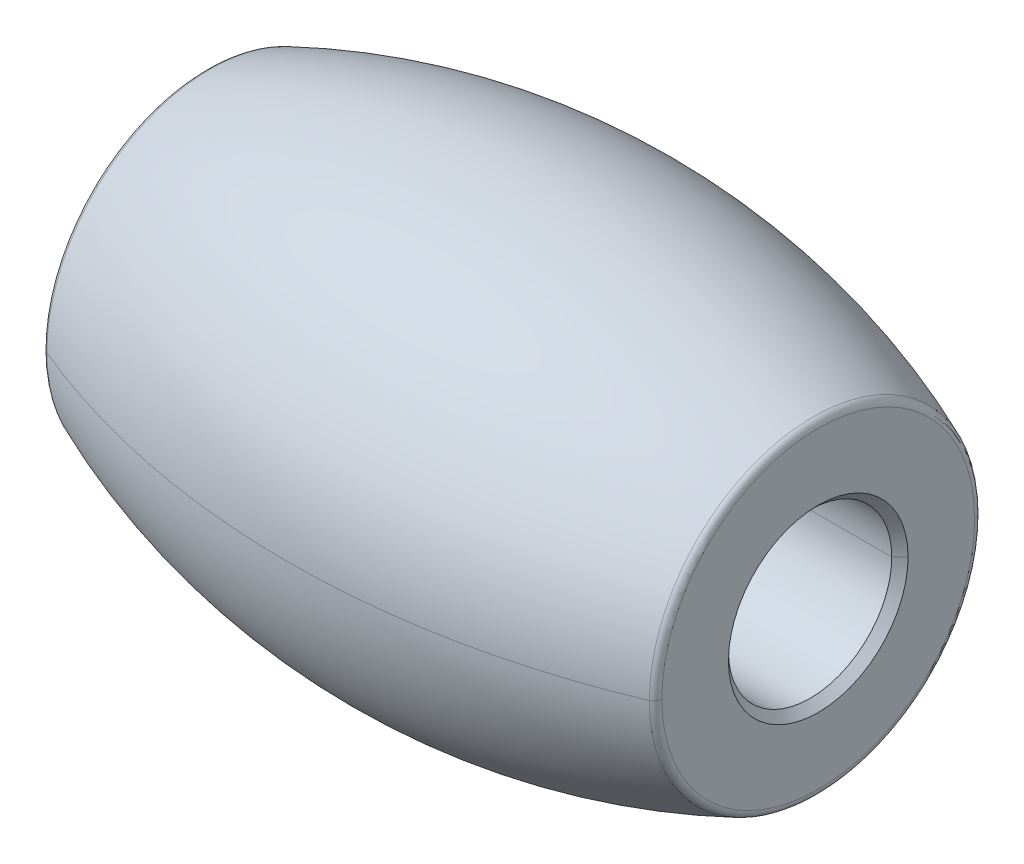
ISO-10303-21;
HEADER;
FILE_DESCRIPTION(('STEP AP214'),'2;1');
FILE_NAME('part.step','',(''),(''),'','','');
FILE_SCHEMA(('AUTOMOTIVE_DESIGN { 1 0 10303 214 1 1 1 1 }'));
ENDSEC;
DATA;
#1=APPLICATION_CONTEXT('core data for automotive mechanical design processes');
#2=APPLICATION_PROTOCOL_DEFINITION('international standard','automotive_design',2000,#1);
#3=PRODUCT_CONTEXT('',#1,'mechanical');
#4=PRODUCT('Part','Part','',(#3));
#5=PRODUCT_RELATED_PRODUCT_CATEGORY('part','',(#4));
#6=PRODUCT_DEFINITION_FORMATION('','',#4);
#7=PRODUCT_DEFINITION_CONTEXT('part definition',#1,'design');
#8=PRODUCT_DEFINITION('design','',#6,#7);
#9=PRODUCT_DEFINITION_SHAPE('','',#8);
#10=(LENGTH_UNIT() NAMED_UNIT(*) SI_UNIT(.MILLI.,.METRE.));
#11=(NAMED_UNIT(*) PLANE_ANGLE_UNIT() SI_UNIT($,.RADIAN.));
#12=(NAMED_UNIT(*) SI_UNIT($,.STERADIAN.) SOLID_ANGLE_UNIT());
#13=UNCERTAINTY_MEASURE_WITH_UNIT(LENGTH_MEASURE(1.E-05),#10,'distance_accuracy_value','');
#14=(GEOMETRIC_REPRESENTATION_CONTEXT(3) GLOBAL_UNCERTAINTY_ASSIGNED_CONTEXT((#13)) GLOBAL_UNIT_ASSIGNED_CONTEXT((#10,
#11,#12)) REPRESENTATION_CONTEXT('',''));
#15=CARTESIAN_POINT('',(0.,0.,0.));
#16=DIRECTION('',(0.,0.,1.));
#17=DIRECTION('',(1.,0.,0.));
#18=AXIS2_PLACEMENT_3D('',#15,#16,#17);
#19=CARTESIAN_POINT('',(211163.408086923,8890.65707126317,4.09347902796675E-10));
#20=DIRECTION('',(1.,0.,0.));
#21=DIRECTION('',(0.,0.,-1.));
#22=AXIS2_PLACEMENT_3D('',#19,#20,#21);
#23=CONICAL_SURFACE('',#22,2.19999999999843,0.785398163308631);
#24=CARTESIAN_POINT('',(211163.208086923,8890.65707126317,3.9974794308062E-10));
#25=DIRECTION('',(-1.,0.,0.));
#26=DIRECTION('',(0.,0.,1.));
#27=AXIS2_PLACEMENT_3D('',#24,#25,#26);
#28=CIRCLE('',#27,1.9999999999989);
#29=CARTESIAN_POINT('',(211163.208086923,8890.65707126315,-1.99999999959914));
#30=VERTEX_POINT('',#29);
#31=CARTESIAN_POINT('',(211163.208086923,8890.65707126317,2.00000000039865));
#32=VERTEX_POINT('',#31);
#33=EDGE_CURVE('E11',#30,#32,#28,.T.);
#34=ORIENTED_EDGE('',*,*,#33,.T.);
#35=DIRECTION('',(0.707106781249349,0.,0.707106781123746));
#36=VECTOR('',#35,1.);
#37=CARTESIAN_POINT('',(211163.408086923,8890.65707126317,2.20000000040779));
#38=LINE('',#37,#36);
#39=CARTESIAN_POINT('',(211163.408086923,8890.65707126317,2.20000000040779));
#40=VERTEX_POINT('',#39);
#41=EDGE_CURVE('E27',#32,#40,#38,.T.);
#42=ORIENTED_EDGE('',*,*,#41,.T.);
#43=CARTESIAN_POINT('',(211163.408086923,8890.65707126317,4.09347902796675E-10));
#44=DIRECTION('',(-1.,0.,0.));
#45=DIRECTION('',(0.,0.,1.));
#46=AXIS2_PLACEMENT_3D('',#43,#44,#45);
#47=CIRCLE('',#46,2.19999999999843);
#48=CARTESIAN_POINT('',(211163.408086923,8890.65707126317,-2.19999999958909));
#49=VERTEX_POINT('',#48);
#50=EDGE_CURVE('E124',#49,#40,#47,.T.);
#51=ORIENTED_EDGE('',*,*,#50,.F.);
#52=DIRECTION('',(0.707106781249349,0.,-0.707106781123746));
#53=VECTOR('',#52,1.);
#54=CARTESIAN_POINT('',(211163.408086923,8890.65707126317,-2.19999999958909));
#55=LINE('',#54,#53);
#56=EDGE_CURVE('E120',#30,#49,#55,.T.);
#57=ORIENTED_EDGE('',*,*,#56,.F.);
#58=EDGE_LOOP('',(#34,#42,#51,#57));
#59=FACE_BOUND('',#58,.T.);
#60=ADVANCED_FACE('F16',(#59),#23,.F.);
#61=CARTESIAN_POINT('',(211146.908086923,8890.65707126315,3.73071365467048E-10));
#62=DIRECTION('',(-1.,0.,0.));
#63=DIRECTION('',(0.,0.,1.));
#64=AXIS2_PLACEMENT_3D('',#61,#62,#63);
#65=CYLINDRICAL_SURFACE('',#64,1.9999999999989);
#66=ORIENTED_EDGE('',*,*,#33,.F.);
#67=DIRECTION('',(-1.,0.,0.));
#68=VECTOR('',#67,1.);
#69=CARTESIAN_POINT('',(211146.908086923,8890.65707126315,-1.99999999962583));
#70=LINE('',#69,#68);
#71=CARTESIAN_POINT('',(211157.858086923,8890.65707126315,-1.99999999963489));
#72=VERTEX_POINT('',#71);
#73=EDGE_CURVE('E135',#30,#72,#70,.T.);
#74=ORIENTED_EDGE('',*,*,#73,.T.);
#75=CARTESIAN_POINT('',(211157.858086923,8890.65707126314,3.64000496411165E-10));
#76=DIRECTION('',(-1.,0.,0.));
#77=DIRECTION('',(0.,0.,1.));
#78=AXIS2_PLACEMENT_3D('',#75,#76,#77);
#79=CIRCLE('',#78,1.9999999999989);
#80=CARTESIAN_POINT('',(211157.858086923,8890.65707126314,2.00000000036291));
#81=VERTEX_POINT('',#80);
#82=EDGE_CURVE('E140',#72,#81,#79,.T.);
#83=ORIENTED_EDGE('',*,*,#82,.T.);
#84=DIRECTION('',(-1.,0.,0.));
#85=VECTOR('',#84,1.);
#86=CARTESIAN_POINT('',(211146.908086923,8890.65707126315,2.00000000037197));
#87=LINE('',#86,#85);
#88=EDGE_CURVE('E42',#32,#81,#87,.T.);
#89=ORIENTED_EDGE('',*,*,#88,.F.);
#90=EDGE_LOOP('',(#66,#74,#83,#89));
#91=FACE_BOUND('',#90,.T.);
#92=ADVANCED_FACE('F142',(#91),#65,.F.);
#93=CARTESIAN_POINT('',(211146.908086923,8890.65707126315,3.73071365467048E-10));
#94=DIRECTION('',(-1.,0.,0.));
#95=DIRECTION('',(0.,0.,1.));
#96=AXIS2_PLACEMENT_3D('',#93,#94,#95);
#97=CYLINDRICAL_SURFACE('',#96,1.09999999999744);
#98=CARTESIAN_POINT('',(211157.858086923,8890.65707126315,2.97747937416659E-10));
#99=DIRECTION('',(-1.,0.,0.));
#100=DIRECTION('',(0.,0.,1.));
#101=AXIS2_PLACEMENT_3D('',#98,#99,#100);
#102=CIRCLE('',#101,1.09999999999744);
#103=CARTESIAN_POINT('',(211157.858086923,8890.65707126315,-1.09999999969969));
#104=VERTEX_POINT('',#103);
#105=CARTESIAN_POINT('',(211157.858086923,8890.65707126315,1.10000000029519));
#106=VERTEX_POINT('',#105);
#107=EDGE_CURVE('E184',#104,#106,#102,.T.);
#108=ORIENTED_EDGE('',*,*,#107,.F.);
#109=DIRECTION('',(-1.,0.,0.));
#110=VECTOR('',#109,1.);
#111=CARTESIAN_POINT('',(211146.908086923,8890.65707126315,-1.09999999962437));
#112=LINE('',#111,#110);
#113=CARTESIAN_POINT('',(211153.958086923,8890.65707126315,-1.09999999955074));
#114=VERTEX_POINT('',#113);
#115=EDGE_CURVE('E200',#104,#114,#112,.T.);
#116=ORIENTED_EDGE('',*,*,#115,.T.);
#117=CARTESIAN_POINT('',(211153.958086923,8890.65707126316,4.46691295064028E-10));
#118=DIRECTION('',(-1.,0.,0.));
#119=DIRECTION('',(0.,0.,1.));
#120=AXIS2_PLACEMENT_3D('',#117,#118,#119);
#121=CIRCLE('',#120,1.09999999999744);
#122=CARTESIAN_POINT('',(211153.958086923,8890.65707126316,1.10000000044413));
#123=VERTEX_POINT('',#122);
#124=EDGE_CURVE('E197',#114,#123,#121,.T.);
#125=ORIENTED_EDGE('',*,*,#124,.T.);
#126=DIRECTION('',(-1.,0.,0.));
#127=VECTOR('',#126,1.);
#128=CARTESIAN_POINT('',(211146.908086923,8890.65707126315,1.10000000037051));
#129=LINE('',#128,#127);
#130=EDGE_CURVE('E188',#106,#123,#129,.T.);
#131=ORIENTED_EDGE('',*,*,#130,.F.);
#132=EDGE_LOOP('',(#108,#116,#125,#131));
#133=FACE_BOUND('',#132,.T.);
#134=ADVANCED_FACE('F307',(#133),#97,.F.);
#135=CARTESIAN_POINT('',(211146.908086923,8890.65707126315,3.73071365467048E-10));
#136=DIRECTION('',(-1.,0.,0.));
#137=DIRECTION('',(0.,0.,1.));
#138=AXIS2_PLACEMENT_3D('',#135,#136,#137);
#139=CYLINDRICAL_SURFACE('',#138,1.9999999999989);
#140=CARTESIAN_POINT('',(211153.958086923,8890.65707126316,4.46691295064028E-10));
#141=DIRECTION('',(-1.,0.,0.));
#142=DIRECTION('',(0.,0.,1.));
#143=AXIS2_PLACEMENT_3D('',#140,#141,#142);
#144=CIRCLE('',#143,1.9999999999989);
#145=CARTESIAN_POINT('',(211153.958086923,8890.65707126315,-1.9999999995522));
#146=VERTEX_POINT('',#145);
#147=CARTESIAN_POINT('',(211153.958086923,8890.65707126316,2.0000000004456));
#148=VERTEX_POINT('',#147);
#149=EDGE_CURVE('E191',#146,#148,#144,.T.);
#150=ORIENTED_EDGE('',*,*,#149,.F.);
#151=DIRECTION('',(-1.,0.,0.));
#152=VECTOR('',#151,1.);
#153=CARTESIAN_POINT('',(211146.908086923,8890.65707126315,-1.99999999962583));
#154=LINE('',#153,#152);
#155=CARTESIAN_POINT('',(211148.608086923,8890.65707126317,-1.99999999963467));
#156=VERTEX_POINT('',#155);
#157=EDGE_CURVE('E158',#146,#156,#154,.T.);
#158=ORIENTED_EDGE('',*,*,#157,.T.);
#159=CARTESIAN_POINT('',(211148.608086923,8890.65707126315,3.64226010463043E-10));
#160=DIRECTION('',(-1.,0.,0.));
#161=DIRECTION('',(0.,0.,1.));
#162=AXIS2_PLACEMENT_3D('',#159,#160,#161);
#163=CIRCLE('',#162,1.9999999999989);
#164=CARTESIAN_POINT('',(211148.608086923,8890.65707126315,2.00000000036313));
#165=VERTEX_POINT('',#164);
#166=EDGE_CURVE('E154',#156,#165,#163,.T.);
#167=ORIENTED_EDGE('',*,*,#166,.T.);
#168=DIRECTION('',(-1.,0.,0.));
#169=VECTOR('',#168,1.);
#170=CARTESIAN_POINT('',(211146.908086923,8890.65707126315,2.00000000037197));
#171=LINE('',#170,#169);
#172=EDGE_CURVE('E164',#148,#165,#171,.T.);
#173=ORIENTED_EDGE('',*,*,#172,.F.);
#174=EDGE_LOOP('',(#150,#158,#167,#173));
#175=FACE_BOUND('',#174,.T.);
#176=ADVANCED_FACE('F18',(#175),#139,.F.);
#177=CARTESIAN_POINT('',(211148.408086923,8890.65707126317,4.47924683455447E-10));
#178=DIRECTION('',(-1.,0.,0.));
#179=DIRECTION('',(0.,0.,1.));
#180=AXIS2_PLACEMENT_3D('',#177,#178,#179);
#181=CONICAL_SURFACE('',#180,2.20000000000732,0.78539816340189);
#182=ORIENTED_EDGE('',*,*,#166,.F.);
#183=DIRECTION('',(-0.707106781183405,0.,-0.70710678118969));
#184=VECTOR('',#183,1.);
#185=CARTESIAN_POINT('',(211148.408086923,8890.65707126317,-2.1999999995594));
#186=LINE('',#185,#184);
#187=CARTESIAN_POINT('',(211148.408086923,8890.65707126317,-2.1999999995594));
#188=VERTEX_POINT('',#187);
#189=EDGE_CURVE('E159',#156,#188,#186,.T.);
#190=ORIENTED_EDGE('',*,*,#189,.T.);
#191=CARTESIAN_POINT('',(211148.408086923,8890.65707126317,4.47924683455447E-10));
#192=DIRECTION('',(-1.,0.,0.));
#193=DIRECTION('',(0.,0.,1.));
#194=AXIS2_PLACEMENT_3D('',#191,#192,#193);
#195=CIRCLE('',#194,2.20000000000732);
#196=CARTESIAN_POINT('',(211148.408086923,8890.65707126317,2.20000000045525));
#197=VERTEX_POINT('',#196);
#198=EDGE_CURVE('E163',#188,#197,#195,.T.);
#199=ORIENTED_EDGE('',*,*,#198,.T.);
#200=DIRECTION('',(-0.707106781183405,0.,0.70710678118969));
#201=VECTOR('',#200,1.);
#202=CARTESIAN_POINT('',(211148.408086923,8890.65707126317,2.20000000045525));
#203=LINE('',#202,#201);
#204=EDGE_CURVE('E202',#165,#197,#203,.T.);
#205=ORIENTED_EDGE('',*,*,#204,.F.);
#206=EDGE_LOOP('',(#182,#190,#199,#205));
#207=FACE_BOUND('',#206,.T.);
#208=ADVANCED_FACE('F423',(#207),#181,.F.);
#209=CARTESIAN_POINT('',(211148.608086922,8890.65707126316,4.53956316981419E-10));
#210=DIRECTION('',(-1.,0.,0.));
#211=DIRECTION('',(0.,0.,1.));
#212=AXIS2_PLACEMENT_3D('',#209,#210,#211);
#213=TOROIDAL_SURFACE('',#212,3.82908231571122,0.200000000000736);
#214=CARTESIAN_POINT('',(211148.530633342,8890.65707126318,4.61207461111002E-10));
#215=DIRECTION('',(-1.,0.,0.));
#216=DIRECTION('',(0.,0.,1.));
#217=AXIS2_PLACEMENT_3D('',#214,#215,#216);
#218=CIRCLE('',#217,4.01347576148938);
#219=CARTESIAN_POINT('',(211148.530633342,8890.65707126318,4.01347576195059));
#220=VERTEX_POINT('',#219);
#221=CARTESIAN_POINT('',(211148.530633342,8890.65707126314,-4.01347576102815));
#222=VERTEX_POINT('',#221);
#223=EDGE_CURVE('E222',#220,#222,#218,.T.);
#224=ORIENTED_EDGE('',*,*,#223,.T.);
#225=CARTESIAN_POINT('',(211148.608086922,8890.65707126316,-3.82908231525728));
#226=DIRECTION('',(0.,1.,0.));
#227=DIRECTION('',(0.,0.,1.));
#228=AXIS2_PLACEMENT_3D('',#225,#226,#227);
#229=CIRCLE('',#228,0.200000000000736);
#230=CARTESIAN_POINT('',(211148.408086923,8890.65707126316,-3.82908231534273));
#231=VERTEX_POINT('',#230);
#232=EDGE_CURVE('E226',#222,#231,#229,.T.);
#233=ORIENTED_EDGE('',*,*,#232,.T.);
#234=CARTESIAN_POINT('',(211148.408086923,8890.65707126318,3.68486491320042E-10));
#235=DIRECTION('',(-1.,0.,0.));
#236=DIRECTION('',(0.,0.,1.));
#237=AXIS2_PLACEMENT_3D('',#234,#235,#236);
#238=CIRCLE('',#237,3.82908231571124);
#239=CARTESIAN_POINT('',(211148.408086923,8890.65707126318,3.82908231607973));
#240=VERTEX_POINT('',#239);
#241=EDGE_CURVE('E175',#240,#231,#238,.T.);
#242=ORIENTED_EDGE('',*,*,#241,.F.);
#243=CARTESIAN_POINT('',(211148.608086922,8890.65707126316,3.8290823161652));
#244=DIRECTION('',(0.,-1.,0.));
#245=DIRECTION('',(1.,0.,0.));
#246=AXIS2_PLACEMENT_3D('',#243,#244,#245);
#247=CIRCLE('',#246,0.20000000000664);
#248=EDGE_CURVE('E174',#220,#240,#247,.T.);
#249=ORIENTED_EDGE('',*,*,#248,.F.);
#250=EDGE_LOOP('',(#224,#233,#242,#249));
#251=FACE_BOUND('',#250,.T.);
#252=ADVANCED_FACE('F437',(#251),#213,.T.);
#253=CARTESIAN_POINT('',(211155.908086912,8890.65707126314,2.86871221222284E-10));
#254=DIRECTION('',(-1.,0.,0.));
#255=DIRECTION('',(0.,0.,-1.));
#256=AXIS2_PLACEMENT_3D('',#253,#254,#255);
#257=DEGENERATE_TOROIDAL_SURFACE('',#256,13.5499999739288,19.050000028357,.F.);
#258=CARTESIAN_POINT('',(211163.285540482,8890.65707126316,3.15025783237388E-10));
#259=DIRECTION('',(-1.,0.,0.));
#260=DIRECTION('',(0.,0.,1.));
#261=AXIS2_PLACEMENT_3D('',#258,#259,#260);
#262=CIRCLE('',#261,4.01347576141832);
#263=CARTESIAN_POINT('',(211163.285540482,8890.65707126319,4.01347576183166));
#264=VERTEX_POINT('',#263);
#265=CARTESIAN_POINT('',(211163.285540482,8890.65707126319,-4.01347576102487));
#266=VERTEX_POINT('',#265);
#267=EDGE_CURVE('E248',#264,#266,#262,.T.);
#268=ORIENTED_EDGE('',*,*,#267,.T.);
#269=CARTESIAN_POINT('',(211155.908086912,8890.65707126314,13.5499999742157));
#270=DIRECTION('',(0.,1.,0.));
#271=DIRECTION('',(0.,0.,1.));
#272=AXIS2_PLACEMENT_3D('',#269,#270,#271);
#273=CIRCLE('',#272,19.050000028357);
#274=EDGE_CURVE('E216',#266,#222,#273,.T.);
#275=ORIENTED_EDGE('',*,*,#274,.T.);
#276=ORIENTED_EDGE('',*,*,#223,.F.);
#277=CARTESIAN_POINT('',(211155.908086912,8890.65707126314,-13.549999973642));
#278=DIRECTION('',(0.,-1.,0.));
#279=DIRECTION('',(1.,0.,0.));
#280=AXIS2_PLACEMENT_3D('',#277,#278,#279);
#281=CIRCLE('',#280,19.0500000283577);
#282=EDGE_CURVE('E173',#264,#220,#281,.T.);
#283=ORIENTED_EDGE('',*,*,#282,.F.);
#284=EDGE_LOOP('',(#268,#275,#276,#283));
#285=FACE_BOUND('',#284,.T.);
#286=ADVANCED_FACE('F515',(#285),#257,.F.);
#287=CARTESIAN_POINT('',(211163.208086961,8890.65707126319,4.91759410969905E-10));
#288=DIRECTION('',(-1.,0.,0.));
#289=DIRECTION('',(0.,0.,1.));
#290=AXIS2_PLACEMENT_3D('',#287,#288,#289);
#291=TOROIDAL_SURFACE('',#290,3.82908229045853,0.20000000001198);
#292=CARTESIAN_POINT('',(211163.408086961,8890.65707126317,3.75616204806306E-10));
#293=DIRECTION('',(-1.,0.,0.));
#294=DIRECTION('',(0.,0.,1.));
#295=AXIS2_PLACEMENT_3D('',#292,#293,#294);
#296=CIRCLE('',#295,3.82908236782422);
#297=CARTESIAN_POINT('',(211163.408086961,8890.65707126317,3.82908236819983));
#298=VERTEX_POINT('',#297);
#299=CARTESIAN_POINT('',(211163.408086961,8890.65707126319,-3.82908236744858));
#300=VERTEX_POINT('',#299);
#301=EDGE_CURVE('E212',#298,#300,#296,.T.);
#302=ORIENTED_EDGE('',*,*,#301,.T.);
#303=CARTESIAN_POINT('',(211163.208086961,8890.65707126319,-3.82908228996679));
#304=DIRECTION('',(0.,1.,0.));
#305=DIRECTION('',(0.,0.,1.));
#306=AXIS2_PLACEMENT_3D('',#303,#304,#305);
#307=CIRCLE('',#306,0.20000000001198);
#308=EDGE_CURVE('E20',#300,#266,#307,.T.);
#309=ORIENTED_EDGE('',*,*,#308,.T.);
#310=ORIENTED_EDGE('',*,*,#267,.F.);
#311=CARTESIAN_POINT('',(211163.208086961,8890.65707126319,3.82908229095031));
#312=DIRECTION('',(0.,-1.,0.));
#313=DIRECTION('',(1.,0.,0.));
#314=AXIS2_PLACEMENT_3D('',#311,#312,#313);
#315=CIRCLE('',#314,0.20000000000664);
#316=EDGE_CURVE('E238',#298,#264,#315,.T.);
#317=ORIENTED_EDGE('',*,*,#316,.F.);
#318=EDGE_LOOP('',(#302,#309,#310,#317));
#319=FACE_BOUND('',#318,.T.);
#320=ADVANCED_FACE('F519',(#319),#291,.T.);
#321=CARTESIAN_POINT('',(211163.208086961,8890.65707126319,4.91759410969905E-10));
#322=DIRECTION('',(-1.,0.,0.));
#323=DIRECTION('',(0.,0.,1.));
#324=AXIS2_PLACEMENT_3D('',#321,#322,#323);
#325=TOROIDAL_SURFACE('',#324,3.82908229045853,0.20000000001198);
#326=ORIENTED_EDGE('',*,*,#308,.F.);
#327=CARTESIAN_POINT('',(211163.408086961,8890.65707126317,3.75616204806306E-10));
#328=DIRECTION('',(-1.,0.,0.));
#329=DIRECTION('',(0.,0.,1.));
#330=AXIS2_PLACEMENT_3D('',#327,#328,#329);
#331=CIRCLE('',#330,3.82908236782422);
#332=EDGE_CURVE('E153',#300,#298,#331,.T.);
#333=ORIENTED_EDGE('',*,*,#332,.T.);
#334=ORIENTED_EDGE('',*,*,#316,.T.);
#335=CARTESIAN_POINT('',(211163.285540482,8890.65707126316,3.15025783237388E-10));
#336=DIRECTION('',(-1.,0.,0.));
#337=DIRECTION('',(0.,0.,1.));
#338=AXIS2_PLACEMENT_3D('',#335,#336,#337);
#339=CIRCLE('',#338,4.01347576141832);
#340=EDGE_CURVE('E208',#266,#264,#339,.T.);
#341=ORIENTED_EDGE('',*,*,#340,.F.);
#342=EDGE_LOOP('',(#326,#333,#334,#341));
#343=FACE_BOUND('',#342,.T.);
#344=ADVANCED_FACE('F464',(#343),#325,.T.);
#345=CARTESIAN_POINT('',(211155.908086912,8890.65707126314,2.86871221222284E-10));
#346=DIRECTION('',(-1.,0.,0.));
#347=DIRECTION('',(0.,0.,-1.));
#348=AXIS2_PLACEMENT_3D('',#345,#346,#347);
#349=DEGENERATE_TOROIDAL_SURFACE('',#348,13.5499999739288,19.050000028357,.F.);
#350=ORIENTED_EDGE('',*,*,#274,.F.);
#351=ORIENTED_EDGE('',*,*,#340,.T.);
#352=ORIENTED_EDGE('',*,*,#282,.T.);
#353=CARTESIAN_POINT('',(211148.530633342,8890.65707126318,4.61207461111002E-10));
#354=DIRECTION('',(-1.,0.,0.));
#355=DIRECTION('',(0.,0.,1.));
#356=AXIS2_PLACEMENT_3D('',#353,#354,#355);
#357=CIRCLE('',#356,4.01347576148938);
#358=EDGE_CURVE('E169',#222,#220,#357,.T.);
#359=ORIENTED_EDGE('',*,*,#358,.F.);
#360=EDGE_LOOP('',(#350,#351,#352,#359));
#361=FACE_BOUND('',#360,.T.);
#362=ADVANCED_FACE('F455',(#361),#349,.F.);
#363=CARTESIAN_POINT('',(211148.608086922,8890.65707126316,4.53956316981419E-10));
#364=DIRECTION('',(-1.,0.,0.));
#365=DIRECTION('',(0.,0.,1.));
#366=AXIS2_PLACEMENT_3D('',#363,#364,#365);
#367=TOROIDAL_SURFACE('',#366,3.82908231571122,0.200000000000736);
#368=ORIENTED_EDGE('',*,*,#232,.F.);
#369=ORIENTED_EDGE('',*,*,#358,.T.);
#370=ORIENTED_EDGE('',*,*,#248,.T.);
#371=CARTESIAN_POINT('',(211148.408086923,8890.65707126318,3.68486491320042E-10));
#372=DIRECTION('',(-1.,0.,0.));
#373=DIRECTION('',(0.,0.,1.));
#374=AXIS2_PLACEMENT_3D('',#371,#372,#373);
#375=CIRCLE('',#374,3.82908231571124);
#376=EDGE_CURVE('E178',#231,#240,#375,.T.);
#377=ORIENTED_EDGE('',*,*,#376,.F.);
#378=EDGE_LOOP('',(#368,#369,#370,#377));
#379=FACE_BOUND('',#378,.T.);
#380=ADVANCED_FACE('F450',(#379),#367,.T.);
#381=CARTESIAN_POINT('',(211148.408086923,8709.56037628199,3.83724302333021E-10));
#382=DIRECTION('',(-1.,0.,0.));
#383=DIRECTION('',(0.,0.,1.));
#384=AXIS2_PLACEMENT_3D('',#381,#382,#383);
#385=PLANE('',#384);
#386=ORIENTED_EDGE('',*,*,#241,.T.);
#387=ORIENTED_EDGE('',*,*,#376,.T.);
#388=EDGE_LOOP('',(#386,#387));
#389=FACE_BOUND('',#388,.T.);
#390=CARTESIAN_POINT('',(211148.408086923,8890.65707126317,4.47924683455447E-10));
#391=DIRECTION('',(-1.,0.,0.));
#392=DIRECTION('',(0.,0.,1.));
#393=AXIS2_PLACEMENT_3D('',#390,#391,#392);
#394=CIRCLE('',#393,2.20000000000732);
#395=EDGE_CURVE('E167',#197,#188,#394,.T.);
#396=ORIENTED_EDGE('',*,*,#395,.F.);
#397=ORIENTED_EDGE('',*,*,#198,.F.);
#398=EDGE_LOOP('',(#396,#397));
#399=FACE_BOUND('',#398,.T.);
#400=ADVANCED_FACE('F454',(#389,#399),#385,.T.);
#401=CARTESIAN_POINT('',(211148.408086923,8890.65707126317,4.47924683455447E-10));
#402=DIRECTION('',(-1.,0.,0.));
#403=DIRECTION('',(0.,0.,1.));
#404=AXIS2_PLACEMENT_3D('',#401,#402,#403);
#405=CONICAL_SURFACE('',#404,2.20000000000732,0.78539816340189);
#406=ORIENTED_EDGE('',*,*,#189,.F.);
#407=CARTESIAN_POINT('',(211148.608086923,8890.65707126315,3.64226010463043E-10));
#408=DIRECTION('',(-1.,0.,0.));
#409=DIRECTION('',(0.,0.,1.));
#410=AXIS2_PLACEMENT_3D('',#407,#408,#409);
#411=CIRCLE('',#410,1.9999999999989);
#412=EDGE_CURVE('E168',#165,#156,#411,.T.);
#413=ORIENTED_EDGE('',*,*,#412,.F.);
#414=ORIENTED_EDGE('',*,*,#204,.T.);
#415=ORIENTED_EDGE('',*,*,#395,.T.);
#416=EDGE_LOOP('',(#406,#413,#414,#415));
#417=FACE_BOUND('',#416,.T.);
#418=ADVANCED_FACE('F473',(#417),#405,.F.);
#419=CARTESIAN_POINT('',(211146.908086923,8890.65707126315,3.73071365467048E-10));
#420=DIRECTION('',(-1.,0.,0.));
#421=DIRECTION('',(0.,0.,1.));
#422=AXIS2_PLACEMENT_3D('',#419,#420,#421);
#423=CYLINDRICAL_SURFACE('',#422,1.9999999999989);
#424=ORIENTED_EDGE('',*,*,#157,.F.);
#425=CARTESIAN_POINT('',(211153.958086923,8890.65707126316,4.46691295064028E-10));
#426=DIRECTION('',(-1.,0.,0.));
#427=DIRECTION('',(0.,0.,1.));
#428=AXIS2_PLACEMENT_3D('',#425,#426,#427);
#429=CIRCLE('',#428,1.9999999999989);
#430=EDGE_CURVE('E241',#148,#146,#429,.T.);
#431=ORIENTED_EDGE('',*,*,#430,.F.);
#432=ORIENTED_EDGE('',*,*,#172,.T.);
#433=ORIENTED_EDGE('',*,*,#412,.T.);
#434=EDGE_LOOP('',(#424,#431,#432,#433));
#435=FACE_BOUND('',#434,.T.);
#436=ADVANCED_FACE('F279',(#435),#423,.F.);
#437=CARTESIAN_POINT('',(211153.958086923,8709.56037628374,5.26526738875432E-10));
#438=DIRECTION('',(-1.,0.,0.));
#439=DIRECTION('',(0.,0.,1.));
#440=AXIS2_PLACEMENT_3D('',#437,#438,#439);
#441=PLANE('',#440);
#442=ORIENTED_EDGE('',*,*,#430,.T.);
#443=ORIENTED_EDGE('',*,*,#149,.T.);
#444=EDGE_LOOP('',(#442,#443));
#445=FACE_BOUND('',#444,.T.);
#446=CARTESIAN_POINT('',(211153.958086923,8890.65707126316,4.46691295064028E-10));
#447=DIRECTION('',(-1.,0.,0.));
#448=DIRECTION('',(0.,0.,1.));
#449=AXIS2_PLACEMENT_3D('',#446,#447,#448);
#450=CIRCLE('',#449,1.09999999999744);
#451=EDGE_CURVE('E183',#123,#114,#450,.T.);
#452=ORIENTED_EDGE('',*,*,#451,.F.);
#453=ORIENTED_EDGE('',*,*,#124,.F.);
#454=EDGE_LOOP('',(#452,#453));
#455=FACE_BOUND('',#454,.T.);
#456=ADVANCED_FACE('F273',(#445,#455),#441,.T.);
#457=CARTESIAN_POINT('',(211146.908086923,8890.65707126315,3.73071365467048E-10));
#458=DIRECTION('',(-1.,0.,0.));
#459=DIRECTION('',(0.,0.,1.));
#460=AXIS2_PLACEMENT_3D('',#457,#458,#459);
#461=CYLINDRICAL_SURFACE('',#460,1.09999999999744);
#462=ORIENTED_EDGE('',*,*,#115,.F.);
#463=CARTESIAN_POINT('',(211157.858086923,8890.65707126315,2.97747937416659E-10));
#464=DIRECTION('',(-1.,0.,0.));
#465=DIRECTION('',(0.,0.,1.));
#466=AXIS2_PLACEMENT_3D('',#463,#464,#465);
#467=CIRCLE('',#466,1.09999999999744);
#468=EDGE_CURVE('E179',#106,#104,#467,.T.);
#469=ORIENTED_EDGE('',*,*,#468,.F.);
#470=ORIENTED_EDGE('',*,*,#130,.T.);
#471=ORIENTED_EDGE('',*,*,#451,.T.);
#472=EDGE_LOOP('',(#462,#469,#470,#471));
#473=FACE_BOUND('',#472,.T.);
#474=ADVANCED_FACE('F310',(#473),#461,.F.);
#475=CARTESIAN_POINT('',(211157.858086923,8709.56037628373,3.77042147503559E-10));
#476=DIRECTION('',(-1.,0.,0.));
#477=DIRECTION('',(0.,0.,1.));
#478=AXIS2_PLACEMENT_3D('',#475,#476,#477);
#479=PLANE('',#478);
#480=CARTESIAN_POINT('',(211157.858086923,8890.65707126314,3.64000496411165E-10));
#481=DIRECTION('',(-1.,0.,0.));
#482=DIRECTION('',(0.,0.,1.));
#483=AXIS2_PLACEMENT_3D('',#480,#481,#482);
#484=CIRCLE('',#483,1.9999999999989);
#485=EDGE_CURVE('E138',#81,#72,#484,.T.);
#486=ORIENTED_EDGE('',*,*,#485,.F.);
#487=ORIENTED_EDGE('',*,*,#82,.F.);
#488=EDGE_LOOP('',(#486,#487));
#489=FACE_BOUND('',#488,.T.);
#490=ORIENTED_EDGE('',*,*,#468,.T.);
#491=ORIENTED_EDGE('',*,*,#107,.T.);
#492=EDGE_LOOP('',(#490,#491));
#493=FACE_BOUND('',#492,.T.);
#494=ADVANCED_FACE('F303',(#489,#493),#479,.F.);
#495=CARTESIAN_POINT('',(211146.908086923,8890.65707126315,3.73071365467048E-10));
#496=DIRECTION('',(-1.,0.,0.));
#497=DIRECTION('',(0.,0.,1.));
#498=AXIS2_PLACEMENT_3D('',#495,#496,#497);
#499=CYLINDRICAL_SURFACE('',#498,1.9999999999989);
#500=ORIENTED_EDGE('',*,*,#73,.F.);
#501=CARTESIAN_POINT('',(211163.208086923,8890.65707126317,3.9974794308062E-10));
#502=DIRECTION('',(-1.,0.,0.));
#503=DIRECTION('',(0.,0.,1.));
#504=AXIS2_PLACEMENT_3D('',#501,#502,#503);
#505=CIRCLE('',#504,1.9999999999989);
#506=EDGE_CURVE('E130',#32,#30,#505,.T.);
#507=ORIENTED_EDGE('',*,*,#506,.F.);
#508=ORIENTED_EDGE('',*,*,#88,.T.);
#509=ORIENTED_EDGE('',*,*,#485,.T.);
#510=EDGE_LOOP('',(#500,#507,#508,#509));
#511=FACE_BOUND('',#510,.T.);
#512=ADVANCED_FACE('F136',(#511),#499,.F.);
#513=CARTESIAN_POINT('',(211163.408086923,8890.65707126317,4.09347902796675E-10));
#514=DIRECTION('',(1.,0.,0.));
#515=DIRECTION('',(0.,0.,-1.));
#516=AXIS2_PLACEMENT_3D('',#513,#514,#515);
#517=CONICAL_SURFACE('',#516,2.19999999999843,0.785398163308631);
#518=ORIENTED_EDGE('',*,*,#41,.F.);
#519=ORIENTED_EDGE('',*,*,#506,.T.);
#520=ORIENTED_EDGE('',*,*,#56,.T.);
#521=CARTESIAN_POINT('',(211163.408086923,8890.65707126317,4.09347902796675E-10));
#522=DIRECTION('',(-1.,0.,0.));
#523=DIRECTION('',(0.,0.,1.));
#524=AXIS2_PLACEMENT_3D('',#521,#522,#523);
#525=CIRCLE('',#524,2.19999999999843);
#526=EDGE_CURVE('E194',#40,#49,#525,.T.);
#527=ORIENTED_EDGE('',*,*,#526,.F.);
#528=EDGE_LOOP('',(#518,#519,#520,#527));
#529=FACE_BOUND('',#528,.T.);
#530=ADVANCED_FACE('F143',(#529),#517,.F.);
#531=CARTESIAN_POINT('',(211163.408086942,8709.56037628373,3.78936465539325E-10));
#532=DIRECTION('',(1.,0.,0.));
#533=DIRECTION('',(0.,0.,1.));
#534=AXIS2_PLACEMENT_3D('',#531,#532,#533);
#535=PLANE('',#534);
#536=ORIENTED_EDGE('',*,*,#301,.F.);
#537=ORIENTED_EDGE('',*,*,#332,.F.);
#538=EDGE_LOOP('',(#536,#537));
#539=FACE_BOUND('',#538,.T.);
#540=ORIENTED_EDGE('',*,*,#50,.T.);
#541=ORIENTED_EDGE('',*,*,#526,.T.);
#542=EDGE_LOOP('',(#540,#541));
#543=FACE_BOUND('',#542,.T.);
#544=ADVANCED_FACE('F430',(#539,#543),#535,.T.);
#545=CLOSED_SHELL('',(#60,#92,#134,#176,#208,#252,#286,#320,#344,#362,#380,#400,#418,#436,#456,
#474,#494,#512,#530,#544));
#546=MANIFOLD_SOLID_BREP('B1',#545);
#547=ADVANCED_BREP_SHAPE_REPRESENTATION('',(#18,#546),#14);
#548=SHAPE_DEFINITION_REPRESENTATION(#9,#547);
ENDSEC;
END-ISO-10303-21;
